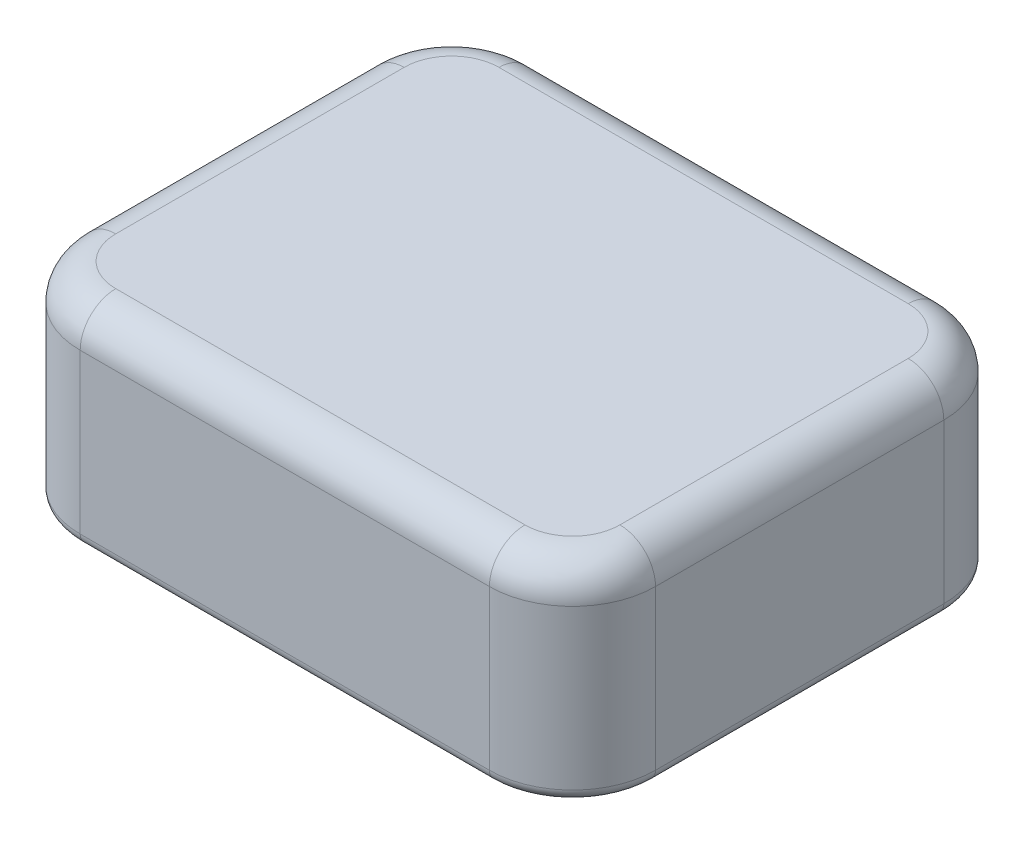
ISO-10303-21;
HEADER;
FILE_DESCRIPTION(('STEP AP214'),'2;1');
FILE_NAME('part.step','',(''),(''),'','','');
FILE_SCHEMA(('AUTOMOTIVE_DESIGN { 1 0 10303 214 1 1 1 1 }'));
ENDSEC;
DATA;
#1=APPLICATION_CONTEXT('core data for automotive mechanical design processes');
#2=APPLICATION_PROTOCOL_DEFINITION('international standard','automotive_design',2000,#1);
#3=PRODUCT_CONTEXT('',#1,'mechanical');
#4=PRODUCT('Part','Part','',(#3));
#5=PRODUCT_RELATED_PRODUCT_CATEGORY('part','',(#4));
#6=PRODUCT_DEFINITION_FORMATION('','',#4);
#7=PRODUCT_DEFINITION_CONTEXT('part definition',#1,'design');
#8=PRODUCT_DEFINITION('design','',#6,#7);
#9=PRODUCT_DEFINITION_SHAPE('','',#8);
#10=(LENGTH_UNIT() NAMED_UNIT(*) SI_UNIT(.MILLI.,.METRE.));
#11=(NAMED_UNIT(*) PLANE_ANGLE_UNIT() SI_UNIT($,.RADIAN.));
#12=(NAMED_UNIT(*) SI_UNIT($,.STERADIAN.) SOLID_ANGLE_UNIT());
#13=UNCERTAINTY_MEASURE_WITH_UNIT(LENGTH_MEASURE(1.E-05),#10,'distance_accuracy_value','');
#14=(GEOMETRIC_REPRESENTATION_CONTEXT(3) GLOBAL_UNCERTAINTY_ASSIGNED_CONTEXT((#13)) GLOBAL_UNIT_ASSIGNED_CONTEXT((#10,
#11,#12)) REPRESENTATION_CONTEXT('',''));
#15=CARTESIAN_POINT('',(0.,0.,0.));
#16=DIRECTION('',(0.,0.,1.));
#17=DIRECTION('',(1.,0.,0.));
#18=AXIS2_PLACEMENT_3D('',#15,#16,#17);
#19=CARTESIAN_POINT('',(24.245,8.705,19.15));
#20=DIRECTION('',(-1.,0.,0.));
#21=DIRECTION('',(0.,0.,1.));
#22=AXIS2_PLACEMENT_3D('',#19,#20,#21);
#23=PLANE('',#22);
#24=DIRECTION('',(0.,-1.,0.));
#25=VECTOR('',#24,1.);
#26=CARTESIAN_POINT('',(24.245,8.705,12.15));
#27=LINE('',#26,#25);
#28=CARTESIAN_POINT('',(24.245,5.705,12.15));
#29=VERTEX_POINT('',#28);
#30=CARTESIAN_POINT('',(24.245,-7.705,12.15));
#31=VERTEX_POINT('',#30);
#32=EDGE_CURVE('E297',#29,#31,#27,.T.);
#33=ORIENTED_EDGE('',*,*,#32,.T.);
#34=DIRECTION('',(0.,0.,-1.));
#35=VECTOR('',#34,1.);
#36=CARTESIAN_POINT('',(24.245,-7.705,-12.15));
#37=LINE('',#36,#35);
#38=CARTESIAN_POINT('',(24.245,-7.705,-12.15));
#39=VERTEX_POINT('',#38);
#40=EDGE_CURVE('E248',#31,#39,#37,.T.);
#41=ORIENTED_EDGE('',*,*,#40,.T.);
#42=DIRECTION('',(0.,-1.,0.));
#43=VECTOR('',#42,1.);
#44=CARTESIAN_POINT('',(24.245,8.705,-12.15));
#45=LINE('',#44,#43);
#46=CARTESIAN_POINT('',(24.245,5.705,-12.15));
#47=VERTEX_POINT('',#46);
#48=EDGE_CURVE('E289',#39,#47,#45,.F.);
#49=ORIENTED_EDGE('',*,*,#48,.T.);
#50=DIRECTION('',(0.,0.,-1.));
#51=VECTOR('',#50,1.);
#52=CARTESIAN_POINT('',(24.245,5.705,19.15));
#53=LINE('',#52,#51);
#54=EDGE_CURVE('E195',#47,#29,#53,.F.);
#55=ORIENTED_EDGE('',*,*,#54,.T.);
#56=EDGE_LOOP('',(#33,#41,#49,#55));
#57=FACE_BOUND('',#56,.T.);
#58=ADVANCED_FACE('F38',(#57),#23,.F.);
#59=CARTESIAN_POINT('',(-24.245,8.705,-19.15));
#60=DIRECTION('',(0.,0.,1.));
#61=DIRECTION('',(1.,0.,0.));
#62=AXIS2_PLACEMENT_3D('',#59,#60,#61);
#63=PLANE('',#62);
#64=DIRECTION('',(0.,-1.,0.));
#65=VECTOR('',#64,1.);
#66=CARTESIAN_POINT('',(17.245,8.705,-19.15));
#67=LINE('',#66,#65);
#68=CARTESIAN_POINT('',(17.245,5.705,-19.15));
#69=VERTEX_POINT('',#68);
#70=CARTESIAN_POINT('',(17.245,-7.705,-19.15));
#71=VERTEX_POINT('',#70);
#72=EDGE_CURVE('E287',#69,#71,#67,.T.);
#73=ORIENTED_EDGE('',*,*,#72,.T.);
#74=DIRECTION('',(-1.,0.,0.));
#75=VECTOR('',#74,1.);
#76=CARTESIAN_POINT('',(-17.245,-7.705,-19.15));
#77=LINE('',#76,#75);
#78=CARTESIAN_POINT('',(-17.245,-7.705,-19.15));
#79=VERTEX_POINT('',#78);
#80=EDGE_CURVE('E244',#71,#79,#77,.T.);
#81=ORIENTED_EDGE('',*,*,#80,.T.);
#82=DIRECTION('',(0.,-1.,0.));
#83=VECTOR('',#82,1.);
#84=CARTESIAN_POINT('',(-17.245,8.705,-19.15));
#85=LINE('',#84,#83);
#86=CARTESIAN_POINT('',(-17.245,5.705,-19.15));
#87=VERTEX_POINT('',#86);
#88=EDGE_CURVE('E294',#79,#87,#85,.F.);
#89=ORIENTED_EDGE('',*,*,#88,.T.);
#90=DIRECTION('',(-1.,0.,0.));
#91=VECTOR('',#90,1.);
#92=CARTESIAN_POINT('',(-24.245,5.705,-19.15));
#93=LINE('',#92,#91);
#94=EDGE_CURVE('E190',#87,#69,#93,.F.);
#95=ORIENTED_EDGE('',*,*,#94,.T.);
#96=EDGE_LOOP('',(#73,#81,#89,#95));
#97=FACE_BOUND('',#96,.T.);
#98=ADVANCED_FACE('F291',(#97),#63,.F.);
#99=CARTESIAN_POINT('',(-24.245,8.705,19.15));
#100=DIRECTION('',(1.,0.,0.));
#101=DIRECTION('',(0.,0.,-1.));
#102=AXIS2_PLACEMENT_3D('',#99,#100,#101);
#103=PLANE('',#102);
#104=DIRECTION('',(0.,-1.,0.));
#105=VECTOR('',#104,1.);
#106=CARTESIAN_POINT('',(-24.245,8.705,-12.15));
#107=LINE('',#106,#105);
#108=CARTESIAN_POINT('',(-24.245,5.705,-12.15));
#109=VERTEX_POINT('',#108);
#110=CARTESIAN_POINT('',(-24.245,-7.705,-12.15));
#111=VERTEX_POINT('',#110);
#112=EDGE_CURVE('E295',#109,#111,#107,.T.);
#113=ORIENTED_EDGE('',*,*,#112,.T.);
#114=DIRECTION('',(0.,0.,1.));
#115=VECTOR('',#114,1.);
#116=CARTESIAN_POINT('',(-24.245,-7.705,12.15));
#117=LINE('',#116,#115);
#118=CARTESIAN_POINT('',(-24.245,-7.705,12.15));
#119=VERTEX_POINT('',#118);
#120=EDGE_CURVE('E240',#111,#119,#117,.T.);
#121=ORIENTED_EDGE('',*,*,#120,.T.);
#122=DIRECTION('',(0.,-1.,0.));
#123=VECTOR('',#122,1.);
#124=CARTESIAN_POINT('',(-24.245,8.705,12.15));
#125=LINE('',#124,#123);
#126=CARTESIAN_POINT('',(-24.245,5.705,12.15));
#127=VERTEX_POINT('',#126);
#128=EDGE_CURVE('E220',#119,#127,#125,.F.);
#129=ORIENTED_EDGE('',*,*,#128,.T.);
#130=DIRECTION('',(0.,0.,1.));
#131=VECTOR('',#130,1.);
#132=CARTESIAN_POINT('',(-24.245,5.705,19.15));
#133=LINE('',#132,#131);
#134=EDGE_CURVE('E180',#127,#109,#133,.F.);
#135=ORIENTED_EDGE('',*,*,#134,.T.);
#136=EDGE_LOOP('',(#113,#121,#129,#135));
#137=FACE_BOUND('',#136,.T.);
#138=ADVANCED_FACE('F362',(#137),#103,.F.);
#139=CARTESIAN_POINT('',(-24.245,8.705,19.15));
#140=DIRECTION('',(0.,0.,-1.));
#141=DIRECTION('',(-1.,0.,0.));
#142=AXIS2_PLACEMENT_3D('',#139,#140,#141);
#143=PLANE('',#142);
#144=DIRECTION('',(0.,-1.,0.));
#145=VECTOR('',#144,1.);
#146=CARTESIAN_POINT('',(-17.245,8.705,19.15));
#147=LINE('',#146,#145);
#148=CARTESIAN_POINT('',(-17.245,5.705,19.15));
#149=VERTEX_POINT('',#148);
#150=CARTESIAN_POINT('',(-17.245,-7.705,19.15));
#151=VERTEX_POINT('',#150);
#152=EDGE_CURVE('E305',#149,#151,#147,.T.);
#153=ORIENTED_EDGE('',*,*,#152,.T.);
#154=DIRECTION('',(1.,0.,0.));
#155=VECTOR('',#154,1.);
#156=CARTESIAN_POINT('',(17.245,-7.705,19.15));
#157=LINE('',#156,#155);
#158=CARTESIAN_POINT('',(17.245,-7.705,19.15));
#159=VERTEX_POINT('',#158);
#160=EDGE_CURVE('E11',#151,#159,#157,.T.);
#161=ORIENTED_EDGE('',*,*,#160,.T.);
#162=DIRECTION('',(0.,-1.,0.));
#163=VECTOR('',#162,1.);
#164=CARTESIAN_POINT('',(17.245,8.705,19.15));
#165=LINE('',#164,#163);
#166=CARTESIAN_POINT('',(17.245,5.705,19.15));
#167=VERTEX_POINT('',#166);
#168=EDGE_CURVE('E173',#159,#167,#165,.F.);
#169=ORIENTED_EDGE('',*,*,#168,.T.);
#170=DIRECTION('',(1.,0.,0.));
#171=VECTOR('',#170,1.);
#172=CARTESIAN_POINT('',(-24.245,5.705,19.15));
#173=LINE('',#172,#171);
#174=EDGE_CURVE('E200',#167,#149,#173,.F.);
#175=ORIENTED_EDGE('',*,*,#174,.T.);
#176=EDGE_LOOP('',(#153,#161,#169,#175));
#177=FACE_BOUND('',#176,.T.);
#178=ADVANCED_FACE('F331',(#177),#143,.F.);
#179=CARTESIAN_POINT('',(0.,8.705,0.));
#180=DIRECTION('',(0.,-1.,0.));
#181=DIRECTION('',(0.,0.,-1.));
#182=AXIS2_PLACEMENT_3D('',#179,#180,#181);
#183=PLANE('',#182);
#184=DIRECTION('',(0.,0.,1.));
#185=VECTOR('',#184,1.);
#186=CARTESIAN_POINT('',(-21.245,8.705,0.));
#187=LINE('',#186,#185);
#188=CARTESIAN_POINT('',(-21.245,8.705,-12.15));
#189=VERTEX_POINT('',#188);
#190=CARTESIAN_POINT('',(-21.245,8.705,12.15));
#191=VERTEX_POINT('',#190);
#192=EDGE_CURVE('E177',#189,#191,#187,.T.);
#193=ORIENTED_EDGE('',*,*,#192,.T.);
#194=CARTESIAN_POINT('',(-17.245,8.705,12.15));
#195=DIRECTION('',(0.,-1.,0.));
#196=DIRECTION('',(0.,0.,-1.));
#197=AXIS2_PLACEMENT_3D('',#194,#195,#196);
#198=CIRCLE('',#197,4.);
#199=CARTESIAN_POINT('',(-17.245,8.705,16.15));
#200=VERTEX_POINT('',#199);
#201=EDGE_CURVE('E158',#191,#200,#198,.F.);
#202=ORIENTED_EDGE('',*,*,#201,.T.);
#203=DIRECTION('',(1.,0.,0.));
#204=VECTOR('',#203,1.);
#205=CARTESIAN_POINT('',(0.,8.705,16.15));
#206=LINE('',#205,#204);
#207=CARTESIAN_POINT('',(17.245,8.705,16.15));
#208=VERTEX_POINT('',#207);
#209=EDGE_CURVE('E166',#200,#208,#206,.T.);
#210=ORIENTED_EDGE('',*,*,#209,.T.);
#211=CARTESIAN_POINT('',(17.245,8.705,12.15));
#212=DIRECTION('',(0.,-1.,0.));
#213=DIRECTION('',(0.,0.,-1.));
#214=AXIS2_PLACEMENT_3D('',#211,#212,#213);
#215=CIRCLE('',#214,4.);
#216=CARTESIAN_POINT('',(21.245,8.705,12.15));
#217=VERTEX_POINT('',#216);
#218=EDGE_CURVE('E172',#208,#217,#215,.F.);
#219=ORIENTED_EDGE('',*,*,#218,.T.);
#220=DIRECTION('',(0.,0.,-1.));
#221=VECTOR('',#220,1.);
#222=CARTESIAN_POINT('',(21.245,8.705,0.));
#223=LINE('',#222,#221);
#224=CARTESIAN_POINT('',(21.245,8.705,-12.15));
#225=VERTEX_POINT('',#224);
#226=EDGE_CURVE('E309',#217,#225,#223,.T.);
#227=ORIENTED_EDGE('',*,*,#226,.T.);
#228=CARTESIAN_POINT('',(17.245,8.705,-12.15));
#229=DIRECTION('',(0.,-1.,0.));
#230=DIRECTION('',(0.,0.,-1.));
#231=AXIS2_PLACEMENT_3D('',#228,#229,#230);
#232=CIRCLE('',#231,4.);
#233=CARTESIAN_POINT('',(17.245,8.705,-16.15));
#234=VERTEX_POINT('',#233);
#235=EDGE_CURVE('E311',#225,#234,#232,.F.);
#236=ORIENTED_EDGE('',*,*,#235,.T.);
#237=DIRECTION('',(-1.,0.,0.));
#238=VECTOR('',#237,1.);
#239=CARTESIAN_POINT('',(0.,8.705,-16.15));
#240=LINE('',#239,#238);
#241=CARTESIAN_POINT('',(-17.245,8.705,-16.15));
#242=VERTEX_POINT('',#241);
#243=EDGE_CURVE('E313',#234,#242,#240,.T.);
#244=ORIENTED_EDGE('',*,*,#243,.T.);
#245=CARTESIAN_POINT('',(-17.245,8.705,-12.15));
#246=DIRECTION('',(0.,-1.,0.));
#247=DIRECTION('',(0.,0.,-1.));
#248=AXIS2_PLACEMENT_3D('',#245,#246,#247);
#249=CIRCLE('',#248,4.);
#250=EDGE_CURVE('E182',#242,#189,#249,.F.);
#251=ORIENTED_EDGE('',*,*,#250,.T.);
#252=EDGE_LOOP('',(#193,#202,#210,#219,#227,#236,#244,#251));
#253=FACE_BOUND('',#252,.T.);
#254=ADVANCED_FACE('F175',(#253),#183,.F.);
#255=CARTESIAN_POINT('',(0.,-8.705,0.));
#256=DIRECTION('',(0.,-1.,0.));
#257=DIRECTION('',(0.,0.,-1.));
#258=AXIS2_PLACEMENT_3D('',#255,#256,#257);
#259=PLANE('',#258);
#260=DIRECTION('',(1.,0.,0.));
#261=VECTOR('',#260,1.);
#262=CARTESIAN_POINT('',(-17.245,-8.705,18.15));
#263=LINE('',#262,#261);
#264=CARTESIAN_POINT('',(17.245,-8.705,18.15));
#265=VERTEX_POINT('',#264);
#266=CARTESIAN_POINT('',(-17.245,-8.705,18.15));
#267=VERTEX_POINT('',#266);
#268=EDGE_CURVE('E201',#265,#267,#263,.F.);
#269=ORIENTED_EDGE('',*,*,#268,.T.);
#270=CARTESIAN_POINT('',(-17.245,-8.705,12.15));
#271=DIRECTION('',(0.,-1.,0.));
#272=DIRECTION('',(0.,0.,-1.));
#273=AXIS2_PLACEMENT_3D('',#270,#271,#272);
#274=CIRCLE('',#273,6.);
#275=CARTESIAN_POINT('',(-23.245,-8.705,12.15));
#276=VERTEX_POINT('',#275);
#277=EDGE_CURVE('E234',#267,#276,#274,.T.);
#278=ORIENTED_EDGE('',*,*,#277,.T.);
#279=DIRECTION('',(0.,0.,1.));
#280=VECTOR('',#279,1.);
#281=CARTESIAN_POINT('',(-23.245,-8.705,-12.15));
#282=LINE('',#281,#280);
#283=CARTESIAN_POINT('',(-23.245,-8.705,-12.15));
#284=VERTEX_POINT('',#283);
#285=EDGE_CURVE('E232',#276,#284,#282,.F.);
#286=ORIENTED_EDGE('',*,*,#285,.T.);
#287=CARTESIAN_POINT('',(-17.245,-8.705,-12.15));
#288=DIRECTION('',(0.,-1.,0.));
#289=DIRECTION('',(0.,0.,-1.));
#290=AXIS2_PLACEMENT_3D('',#287,#288,#289);
#291=CIRCLE('',#290,6.);
#292=CARTESIAN_POINT('',(-17.245,-8.705,-18.15));
#293=VERTEX_POINT('',#292);
#294=EDGE_CURVE('E230',#284,#293,#291,.T.);
#295=ORIENTED_EDGE('',*,*,#294,.T.);
#296=DIRECTION('',(-1.,0.,0.));
#297=VECTOR('',#296,1.);
#298=CARTESIAN_POINT('',(17.245,-8.705,-18.15));
#299=LINE('',#298,#297);
#300=CARTESIAN_POINT('',(17.245,-8.705,-18.15));
#301=VERTEX_POINT('',#300);
#302=EDGE_CURVE('E228',#293,#301,#299,.F.);
#303=ORIENTED_EDGE('',*,*,#302,.T.);
#304=CARTESIAN_POINT('',(17.245,-8.705,-12.15));
#305=DIRECTION('',(0.,-1.,0.));
#306=DIRECTION('',(0.,0.,-1.));
#307=AXIS2_PLACEMENT_3D('',#304,#305,#306);
#308=CIRCLE('',#307,6.);
#309=CARTESIAN_POINT('',(23.245,-8.705,-12.15));
#310=VERTEX_POINT('',#309);
#311=EDGE_CURVE('E226',#301,#310,#308,.T.);
#312=ORIENTED_EDGE('',*,*,#311,.T.);
#313=DIRECTION('',(0.,0.,-1.));
#314=VECTOR('',#313,1.);
#315=CARTESIAN_POINT('',(23.245,-8.705,12.15));
#316=LINE('',#315,#314);
#317=CARTESIAN_POINT('',(23.245,-8.705,12.15));
#318=VERTEX_POINT('',#317);
#319=EDGE_CURVE('E224',#310,#318,#316,.F.);
#320=ORIENTED_EDGE('',*,*,#319,.T.);
#321=CARTESIAN_POINT('',(17.245,-8.705,12.15));
#322=DIRECTION('',(0.,-1.,0.));
#323=DIRECTION('',(0.,0.,-1.));
#324=AXIS2_PLACEMENT_3D('',#321,#322,#323);
#325=CIRCLE('',#324,6.);
#326=EDGE_CURVE('E222',#318,#265,#325,.T.);
#327=ORIENTED_EDGE('',*,*,#326,.T.);
#328=EDGE_LOOP('',(#269,#278,#286,#295,#303,#312,#320,#327));
#329=FACE_BOUND('',#328,.T.);
#330=ADVANCED_FACE('F369',(#329),#259,.T.);
#331=CARTESIAN_POINT('',(-17.245,8.705,-12.15));
#332=DIRECTION('',(0.,-1.,0.));
#333=DIRECTION('',(0.,0.,-1.));
#334=AXIS2_PLACEMENT_3D('',#331,#332,#333);
#335=CYLINDRICAL_SURFACE('',#334,7.);
#336=ORIENTED_EDGE('',*,*,#88,.F.);
#337=CARTESIAN_POINT('',(-17.245,-7.705,-12.15));
#338=DIRECTION('',(0.,-1.,0.));
#339=DIRECTION('',(0.,0.,-1.));
#340=AXIS2_PLACEMENT_3D('',#337,#338,#339);
#341=CIRCLE('',#340,7.);
#342=EDGE_CURVE('E242',#79,#111,#341,.F.);
#343=ORIENTED_EDGE('',*,*,#342,.T.);
#344=ORIENTED_EDGE('',*,*,#112,.F.);
#345=CARTESIAN_POINT('',(-17.245,5.705,-12.15));
#346=DIRECTION('',(0.,-1.,0.));
#347=DIRECTION('',(0.,0.,-1.));
#348=AXIS2_PLACEMENT_3D('',#345,#346,#347);
#349=CIRCLE('',#348,7.);
#350=EDGE_CURVE('E187',#109,#87,#349,.T.);
#351=ORIENTED_EDGE('',*,*,#350,.T.);
#352=EDGE_LOOP('',(#336,#343,#344,#351));
#353=FACE_BOUND('',#352,.T.);
#354=ADVANCED_FACE('F366',(#353),#335,.T.);
#355=CARTESIAN_POINT('',(17.245,8.705,-12.15));
#356=DIRECTION('',(0.,-1.,0.));
#357=DIRECTION('',(0.,0.,-1.));
#358=AXIS2_PLACEMENT_3D('',#355,#356,#357);
#359=CYLINDRICAL_SURFACE('',#358,7.);
#360=ORIENTED_EDGE('',*,*,#48,.F.);
#361=CARTESIAN_POINT('',(17.245,-7.705,-12.15));
#362=DIRECTION('',(0.,-1.,0.));
#363=DIRECTION('',(0.,0.,-1.));
#364=AXIS2_PLACEMENT_3D('',#361,#362,#363);
#365=CIRCLE('',#364,7.);
#366=EDGE_CURVE('E246',#39,#71,#365,.F.);
#367=ORIENTED_EDGE('',*,*,#366,.T.);
#368=ORIENTED_EDGE('',*,*,#72,.F.);
#369=CARTESIAN_POINT('',(17.245,5.705,-12.15));
#370=DIRECTION('',(0.,-1.,0.));
#371=DIRECTION('',(0.,0.,-1.));
#372=AXIS2_PLACEMENT_3D('',#369,#370,#371);
#373=CIRCLE('',#372,7.);
#374=EDGE_CURVE('E192',#69,#47,#373,.T.);
#375=ORIENTED_EDGE('',*,*,#374,.T.);
#376=EDGE_LOOP('',(#360,#367,#368,#375));
#377=FACE_BOUND('',#376,.T.);
#378=ADVANCED_FACE('F286',(#377),#359,.T.);
#379=CARTESIAN_POINT('',(17.245,8.705,12.15));
#380=DIRECTION('',(0.,-1.,0.));
#381=DIRECTION('',(0.,0.,-1.));
#382=AXIS2_PLACEMENT_3D('',#379,#380,#381);
#383=CYLINDRICAL_SURFACE('',#382,7.);
#384=ORIENTED_EDGE('',*,*,#168,.F.);
#385=CARTESIAN_POINT('',(17.245,-7.705,12.15));
#386=DIRECTION('',(0.,-1.,0.));
#387=DIRECTION('',(0.,0.,-1.));
#388=AXIS2_PLACEMENT_3D('',#385,#386,#387);
#389=CIRCLE('',#388,7.);
#390=EDGE_CURVE('E47',#159,#31,#389,.F.);
#391=ORIENTED_EDGE('',*,*,#390,.T.);
#392=ORIENTED_EDGE('',*,*,#32,.F.);
#393=CARTESIAN_POINT('',(17.245,5.705,12.15));
#394=DIRECTION('',(0.,-1.,0.));
#395=DIRECTION('',(0.,0.,-1.));
#396=AXIS2_PLACEMENT_3D('',#393,#394,#395);
#397=CIRCLE('',#396,7.);
#398=EDGE_CURVE('E197',#29,#167,#397,.T.);
#399=ORIENTED_EDGE('',*,*,#398,.T.);
#400=EDGE_LOOP('',(#384,#391,#392,#399));
#401=FACE_BOUND('',#400,.T.);
#402=ADVANCED_FACE('F333',(#401),#383,.T.);
#403=CARTESIAN_POINT('',(-17.245,8.705,12.15));
#404=DIRECTION('',(0.,-1.,0.));
#405=DIRECTION('',(0.,0.,-1.));
#406=AXIS2_PLACEMENT_3D('',#403,#404,#405);
#407=CYLINDRICAL_SURFACE('',#406,7.);
#408=ORIENTED_EDGE('',*,*,#128,.F.);
#409=CARTESIAN_POINT('',(-17.245,-7.705,12.15));
#410=DIRECTION('',(0.,-1.,0.));
#411=DIRECTION('',(0.,0.,-1.));
#412=AXIS2_PLACEMENT_3D('',#409,#410,#411);
#413=CIRCLE('',#412,7.);
#414=EDGE_CURVE('E237',#119,#151,#413,.F.);
#415=ORIENTED_EDGE('',*,*,#414,.T.);
#416=ORIENTED_EDGE('',*,*,#152,.F.);
#417=CARTESIAN_POINT('',(-17.245,5.705,12.15));
#418=DIRECTION('',(0.,-1.,0.));
#419=DIRECTION('',(0.,0.,-1.));
#420=AXIS2_PLACEMENT_3D('',#417,#418,#419);
#421=CIRCLE('',#420,7.);
#422=EDGE_CURVE('E160',#149,#127,#421,.T.);
#423=ORIENTED_EDGE('',*,*,#422,.T.);
#424=EDGE_LOOP('',(#408,#415,#416,#423));
#425=FACE_BOUND('',#424,.T.);
#426=ADVANCED_FACE('F329',(#425),#407,.T.);
#427=CARTESIAN_POINT('',(17.245,5.705,-12.15));
#428=DIRECTION('',(0.,-1.,0.));
#429=DIRECTION('',(0.,0.,-1.));
#430=AXIS2_PLACEMENT_3D('',#427,#428,#429);
#431=TOROIDAL_SURFACE('',#430,4.,3.);
#432=CARTESIAN_POINT('',(21.245,5.705,-12.15));
#433=DIRECTION('',(0.,0.,1.));
#434=DIRECTION('',(1.,0.,0.));
#435=AXIS2_PLACEMENT_3D('',#432,#433,#434);
#436=CIRCLE('',#435,3.);
#437=EDGE_CURVE('E214',#47,#225,#436,.T.);
#438=ORIENTED_EDGE('',*,*,#437,.F.);
#439=ORIENTED_EDGE('',*,*,#374,.F.);
#440=CARTESIAN_POINT('',(17.245,5.705,-16.15));
#441=DIRECTION('',(-1.,0.,0.));
#442=DIRECTION('',(0.,0.,1.));
#443=AXIS2_PLACEMENT_3D('',#440,#441,#442);
#444=CIRCLE('',#443,3.);
#445=EDGE_CURVE('E217',#234,#69,#444,.T.);
#446=ORIENTED_EDGE('',*,*,#445,.F.);
#447=ORIENTED_EDGE('',*,*,#235,.F.);
#448=EDGE_LOOP('',(#438,#439,#446,#447));
#449=FACE_BOUND('',#448,.T.);
#450=ADVANCED_FACE('F344',(#449),#431,.T.);
#451=CARTESIAN_POINT('',(0.,5.705,-16.15));
#452=DIRECTION('',(-1.,0.,0.));
#453=DIRECTION('',(0.,0.,1.));
#454=AXIS2_PLACEMENT_3D('',#451,#452,#453);
#455=CYLINDRICAL_SURFACE('',#454,3.);
#456=ORIENTED_EDGE('',*,*,#445,.T.);
#457=ORIENTED_EDGE('',*,*,#94,.F.);
#458=CARTESIAN_POINT('',(-17.245,5.705,-16.15));
#459=DIRECTION('',(-1.,0.,0.));
#460=DIRECTION('',(0.,0.,1.));
#461=AXIS2_PLACEMENT_3D('',#458,#459,#460);
#462=CIRCLE('',#461,3.);
#463=EDGE_CURVE('E211',#242,#87,#462,.T.);
#464=ORIENTED_EDGE('',*,*,#463,.F.);
#465=ORIENTED_EDGE('',*,*,#243,.F.);
#466=EDGE_LOOP('',(#456,#457,#464,#465));
#467=FACE_BOUND('',#466,.T.);
#468=ADVANCED_FACE('F347',(#467),#455,.T.);
#469=CARTESIAN_POINT('',(21.245,5.705,0.));
#470=DIRECTION('',(0.,0.,-1.));
#471=DIRECTION('',(-1.,0.,0.));
#472=AXIS2_PLACEMENT_3D('',#469,#470,#471);
#473=CYLINDRICAL_SURFACE('',#472,3.);
#474=ORIENTED_EDGE('',*,*,#437,.T.);
#475=ORIENTED_EDGE('',*,*,#226,.F.);
#476=CARTESIAN_POINT('',(21.245,5.705,12.15));
#477=DIRECTION('',(0.,0.,1.));
#478=DIRECTION('',(1.,0.,0.));
#479=AXIS2_PLACEMENT_3D('',#476,#477,#478);
#480=CIRCLE('',#479,3.);
#481=EDGE_CURVE('E208',#29,#217,#480,.T.);
#482=ORIENTED_EDGE('',*,*,#481,.F.);
#483=ORIENTED_EDGE('',*,*,#54,.F.);
#484=EDGE_LOOP('',(#474,#475,#482,#483));
#485=FACE_BOUND('',#484,.T.);
#486=ADVANCED_FACE('F340',(#485),#473,.T.);
#487=CARTESIAN_POINT('',(-17.245,5.705,-12.15));
#488=DIRECTION('',(0.,-1.,0.));
#489=DIRECTION('',(0.,0.,-1.));
#490=AXIS2_PLACEMENT_3D('',#487,#488,#489);
#491=TOROIDAL_SURFACE('',#490,4.,3.);
#492=ORIENTED_EDGE('',*,*,#463,.T.);
#493=ORIENTED_EDGE('',*,*,#350,.F.);
#494=CARTESIAN_POINT('',(-21.245,5.705,-12.15));
#495=DIRECTION('',(0.,0.,1.));
#496=DIRECTION('',(1.,0.,0.));
#497=AXIS2_PLACEMENT_3D('',#494,#495,#496);
#498=CIRCLE('',#497,3.);
#499=EDGE_CURVE('E205',#189,#109,#498,.T.);
#500=ORIENTED_EDGE('',*,*,#499,.F.);
#501=ORIENTED_EDGE('',*,*,#250,.F.);
#502=EDGE_LOOP('',(#492,#493,#500,#501));
#503=FACE_BOUND('',#502,.T.);
#504=ADVANCED_FACE('F320',(#503),#491,.T.);
#505=CARTESIAN_POINT('',(17.245,5.705,12.15));
#506=DIRECTION('',(0.,-1.,0.));
#507=DIRECTION('',(0.,0.,-1.));
#508=AXIS2_PLACEMENT_3D('',#505,#506,#507);
#509=TOROIDAL_SURFACE('',#508,4.,3.);
#510=ORIENTED_EDGE('',*,*,#481,.T.);
#511=ORIENTED_EDGE('',*,*,#218,.F.);
#512=CARTESIAN_POINT('',(17.245,5.705,16.15));
#513=DIRECTION('',(-1.,0.,0.));
#514=DIRECTION('',(0.,0.,1.));
#515=AXIS2_PLACEMENT_3D('',#512,#513,#514);
#516=CIRCLE('',#515,3.);
#517=EDGE_CURVE('E169',#167,#208,#516,.T.);
#518=ORIENTED_EDGE('',*,*,#517,.F.);
#519=ORIENTED_EDGE('',*,*,#398,.F.);
#520=EDGE_LOOP('',(#510,#511,#518,#519));
#521=FACE_BOUND('',#520,.T.);
#522=ADVANCED_FACE('F336',(#521),#509,.T.);
#523=CARTESIAN_POINT('',(-21.245,5.705,0.));
#524=DIRECTION('',(0.,0.,1.));
#525=DIRECTION('',(1.,0.,0.));
#526=AXIS2_PLACEMENT_3D('',#523,#524,#525);
#527=CYLINDRICAL_SURFACE('',#526,3.);
#528=ORIENTED_EDGE('',*,*,#499,.T.);
#529=ORIENTED_EDGE('',*,*,#134,.F.);
#530=CARTESIAN_POINT('',(-21.245,5.705,12.15));
#531=DIRECTION('',(0.,0.,1.));
#532=DIRECTION('',(1.,0.,0.));
#533=AXIS2_PLACEMENT_3D('',#530,#531,#532);
#534=CIRCLE('',#533,3.);
#535=EDGE_CURVE('E163',#191,#127,#534,.T.);
#536=ORIENTED_EDGE('',*,*,#535,.F.);
#537=ORIENTED_EDGE('',*,*,#192,.F.);
#538=EDGE_LOOP('',(#528,#529,#536,#537));
#539=FACE_BOUND('',#538,.T.);
#540=ADVANCED_FACE('F323',(#539),#527,.T.);
#541=CARTESIAN_POINT('',(0.,5.705,16.15));
#542=DIRECTION('',(1.,0.,0.));
#543=DIRECTION('',(0.,0.,-1.));
#544=AXIS2_PLACEMENT_3D('',#541,#542,#543);
#545=CYLINDRICAL_SURFACE('',#544,3.);
#546=ORIENTED_EDGE('',*,*,#517,.T.);
#547=ORIENTED_EDGE('',*,*,#209,.F.);
#548=CARTESIAN_POINT('',(-17.245,5.705,16.15));
#549=DIRECTION('',(-1.,0.,0.));
#550=DIRECTION('',(0.,0.,1.));
#551=AXIS2_PLACEMENT_3D('',#548,#549,#550);
#552=CIRCLE('',#551,3.);
#553=EDGE_CURVE('E153',#149,#200,#552,.T.);
#554=ORIENTED_EDGE('',*,*,#553,.F.);
#555=ORIENTED_EDGE('',*,*,#174,.F.);
#556=EDGE_LOOP('',(#546,#547,#554,#555));
#557=FACE_BOUND('',#556,.T.);
#558=ADVANCED_FACE('F167',(#557),#545,.T.);
#559=CARTESIAN_POINT('',(-17.245,5.705,12.15));
#560=DIRECTION('',(0.,-1.,0.));
#561=DIRECTION('',(0.,0.,-1.));
#562=AXIS2_PLACEMENT_3D('',#559,#560,#561);
#563=TOROIDAL_SURFACE('',#562,4.,3.);
#564=ORIENTED_EDGE('',*,*,#535,.T.);
#565=ORIENTED_EDGE('',*,*,#422,.F.);
#566=ORIENTED_EDGE('',*,*,#553,.T.);
#567=ORIENTED_EDGE('',*,*,#201,.F.);
#568=EDGE_LOOP('',(#564,#565,#566,#567));
#569=FACE_BOUND('',#568,.T.);
#570=ADVANCED_FACE('F156',(#569),#563,.T.);
#571=CARTESIAN_POINT('',(17.245,-7.705,-12.15));
#572=DIRECTION('',(0.,-1.,0.));
#573=DIRECTION('',(0.,0.,-1.));
#574=AXIS2_PLACEMENT_3D('',#571,#572,#573);
#575=TOROIDAL_SURFACE('',#574,6.,1.);
#576=CARTESIAN_POINT('',(17.245,-7.705,-18.15));
#577=DIRECTION('',(-1.,0.,0.));
#578=DIRECTION('',(0.,0.,1.));
#579=AXIS2_PLACEMENT_3D('',#576,#577,#578);
#580=CIRCLE('',#579,1.);
#581=EDGE_CURVE('E266',#71,#301,#580,.T.);
#582=ORIENTED_EDGE('',*,*,#581,.F.);
#583=ORIENTED_EDGE('',*,*,#366,.F.);
#584=CARTESIAN_POINT('',(23.245,-7.705,-12.15));
#585=DIRECTION('',(0.,0.,1.));
#586=DIRECTION('',(1.,0.,0.));
#587=AXIS2_PLACEMENT_3D('',#584,#585,#586);
#588=CIRCLE('',#587,1.);
#589=EDGE_CURVE('E42',#310,#39,#588,.T.);
#590=ORIENTED_EDGE('',*,*,#589,.F.);
#591=ORIENTED_EDGE('',*,*,#311,.F.);
#592=EDGE_LOOP('',(#582,#583,#590,#591));
#593=FACE_BOUND('',#592,.T.);
#594=ADVANCED_FACE('F40',(#593),#575,.T.);
#595=CARTESIAN_POINT('',(23.245,-7.705,19.15));
#596=DIRECTION('',(0.,0.,1.));
#597=DIRECTION('',(1.,0.,0.));
#598=AXIS2_PLACEMENT_3D('',#595,#596,#597);
#599=CYLINDRICAL_SURFACE('',#598,1.);
#600=ORIENTED_EDGE('',*,*,#589,.T.);
#601=ORIENTED_EDGE('',*,*,#40,.F.);
#602=CARTESIAN_POINT('',(23.245,-7.705,12.15));
#603=DIRECTION('',(0.,0.,1.));
#604=DIRECTION('',(1.,0.,0.));
#605=AXIS2_PLACEMENT_3D('',#602,#603,#604);
#606=CIRCLE('',#605,1.);
#607=EDGE_CURVE('E264',#318,#31,#606,.T.);
#608=ORIENTED_EDGE('',*,*,#607,.F.);
#609=ORIENTED_EDGE('',*,*,#319,.F.);
#610=EDGE_LOOP('',(#600,#601,#608,#609));
#611=FACE_BOUND('',#610,.T.);
#612=ADVANCED_FACE('F277',(#611),#599,.T.);
#613=CARTESIAN_POINT('',(-24.245,-7.705,-18.15));
#614=DIRECTION('',(1.,0.,0.));
#615=DIRECTION('',(0.,0.,-1.));
#616=AXIS2_PLACEMENT_3D('',#613,#614,#615);
#617=CYLINDRICAL_SURFACE('',#616,1.);
#618=ORIENTED_EDGE('',*,*,#581,.T.);
#619=ORIENTED_EDGE('',*,*,#302,.F.);
#620=CARTESIAN_POINT('',(-17.245,-7.705,-18.15));
#621=DIRECTION('',(-1.,0.,0.));
#622=DIRECTION('',(0.,0.,1.));
#623=AXIS2_PLACEMENT_3D('',#620,#621,#622);
#624=CIRCLE('',#623,1.);
#625=EDGE_CURVE('E261',#79,#293,#624,.T.);
#626=ORIENTED_EDGE('',*,*,#625,.F.);
#627=ORIENTED_EDGE('',*,*,#80,.F.);
#628=EDGE_LOOP('',(#618,#619,#626,#627));
#629=FACE_BOUND('',#628,.T.);
#630=ADVANCED_FACE('F418',(#629),#617,.T.);
#631=CARTESIAN_POINT('',(17.245,-7.705,12.15));
#632=DIRECTION('',(0.,-1.,0.));
#633=DIRECTION('',(0.,0.,-1.));
#634=AXIS2_PLACEMENT_3D('',#631,#632,#633);
#635=TOROIDAL_SURFACE('',#634,6.,1.);
#636=ORIENTED_EDGE('',*,*,#607,.T.);
#637=ORIENTED_EDGE('',*,*,#390,.F.);
#638=CARTESIAN_POINT('',(17.245,-7.705,18.15));
#639=DIRECTION('',(-1.,0.,0.));
#640=DIRECTION('',(0.,0.,1.));
#641=AXIS2_PLACEMENT_3D('',#638,#639,#640);
#642=CIRCLE('',#641,1.);
#643=EDGE_CURVE('E258',#265,#159,#642,.T.);
#644=ORIENTED_EDGE('',*,*,#643,.F.);
#645=ORIENTED_EDGE('',*,*,#326,.F.);
#646=EDGE_LOOP('',(#636,#637,#644,#645));
#647=FACE_BOUND('',#646,.T.);
#648=ADVANCED_FACE('F424',(#647),#635,.T.);
#649=CARTESIAN_POINT('',(-17.245,-7.705,-12.15));
#650=DIRECTION('',(0.,-1.,0.));
#651=DIRECTION('',(0.,0.,-1.));
#652=AXIS2_PLACEMENT_3D('',#649,#650,#651);
#653=TOROIDAL_SURFACE('',#652,6.,1.);
#654=ORIENTED_EDGE('',*,*,#625,.T.);
#655=ORIENTED_EDGE('',*,*,#294,.F.);
#656=CARTESIAN_POINT('',(-23.245,-7.705,-12.15));
#657=DIRECTION('',(0.,0.,1.));
#658=DIRECTION('',(1.,0.,0.));
#659=AXIS2_PLACEMENT_3D('',#656,#657,#658);
#660=CIRCLE('',#659,1.);
#661=EDGE_CURVE('E255',#111,#284,#660,.T.);
#662=ORIENTED_EDGE('',*,*,#661,.F.);
#663=ORIENTED_EDGE('',*,*,#342,.F.);
#664=EDGE_LOOP('',(#654,#655,#662,#663));
#665=FACE_BOUND('',#664,.T.);
#666=ADVANCED_FACE('F431',(#665),#653,.T.);
#667=CARTESIAN_POINT('',(-24.245,-7.705,18.15));
#668=DIRECTION('',(-1.,0.,0.));
#669=DIRECTION('',(0.,0.,1.));
#670=AXIS2_PLACEMENT_3D('',#667,#668,#669);
#671=CYLINDRICAL_SURFACE('',#670,1.);
#672=ORIENTED_EDGE('',*,*,#643,.T.);
#673=ORIENTED_EDGE('',*,*,#160,.F.);
#674=CARTESIAN_POINT('',(-17.245,-7.705,18.15));
#675=DIRECTION('',(-1.,0.,0.));
#676=DIRECTION('',(0.,0.,1.));
#677=AXIS2_PLACEMENT_3D('',#674,#675,#676);
#678=CIRCLE('',#677,1.);
#679=EDGE_CURVE('E253',#267,#151,#678,.T.);
#680=ORIENTED_EDGE('',*,*,#679,.F.);
#681=ORIENTED_EDGE('',*,*,#268,.F.);
#682=EDGE_LOOP('',(#672,#673,#680,#681));
#683=FACE_BOUND('',#682,.T.);
#684=ADVANCED_FACE('F439',(#683),#671,.T.);
#685=CARTESIAN_POINT('',(-23.245,-7.705,19.15));
#686=DIRECTION('',(0.,0.,-1.));
#687=DIRECTION('',(-1.,0.,0.));
#688=AXIS2_PLACEMENT_3D('',#685,#686,#687);
#689=CYLINDRICAL_SURFACE('',#688,1.);
#690=ORIENTED_EDGE('',*,*,#661,.T.);
#691=ORIENTED_EDGE('',*,*,#285,.F.);
#692=CARTESIAN_POINT('',(-23.245,-7.705,12.15));
#693=DIRECTION('',(0.,0.,1.));
#694=DIRECTION('',(1.,0.,0.));
#695=AXIS2_PLACEMENT_3D('',#692,#693,#694);
#696=CIRCLE('',#695,1.);
#697=EDGE_CURVE('E251',#119,#276,#696,.T.);
#698=ORIENTED_EDGE('',*,*,#697,.F.);
#699=ORIENTED_EDGE('',*,*,#120,.F.);
#700=EDGE_LOOP('',(#690,#691,#698,#699));
#701=FACE_BOUND('',#700,.T.);
#702=ADVANCED_FACE('F447',(#701),#689,.T.);
#703=CARTESIAN_POINT('',(-17.245,-7.705,12.15));
#704=DIRECTION('',(0.,-1.,0.));
#705=DIRECTION('',(0.,0.,-1.));
#706=AXIS2_PLACEMENT_3D('',#703,#704,#705);
#707=TOROIDAL_SURFACE('',#706,6.,1.);
#708=ORIENTED_EDGE('',*,*,#679,.T.);
#709=ORIENTED_EDGE('',*,*,#414,.F.);
#710=ORIENTED_EDGE('',*,*,#697,.T.);
#711=ORIENTED_EDGE('',*,*,#277,.F.);
#712=EDGE_LOOP('',(#708,#709,#710,#711));
#713=FACE_BOUND('',#712,.T.);
#714=ADVANCED_FACE('F455',(#713),#707,.T.);
#715=CLOSED_SHELL('',(#58,#98,#138,#178,#254,#330,#354,#378,#402,#426,#450,#468,#486,#504,#522,
#540,#558,#570,#594,#612,#630,#648,#666,#684,#702,#714));
#716=MANIFOLD_SOLID_BREP('B2',#715);
#717=ADVANCED_BREP_SHAPE_REPRESENTATION('',(#18,#716),#14);
#718=SHAPE_DEFINITION_REPRESENTATION(#9,#717);
ENDSEC;
END-ISO-10303-21;
